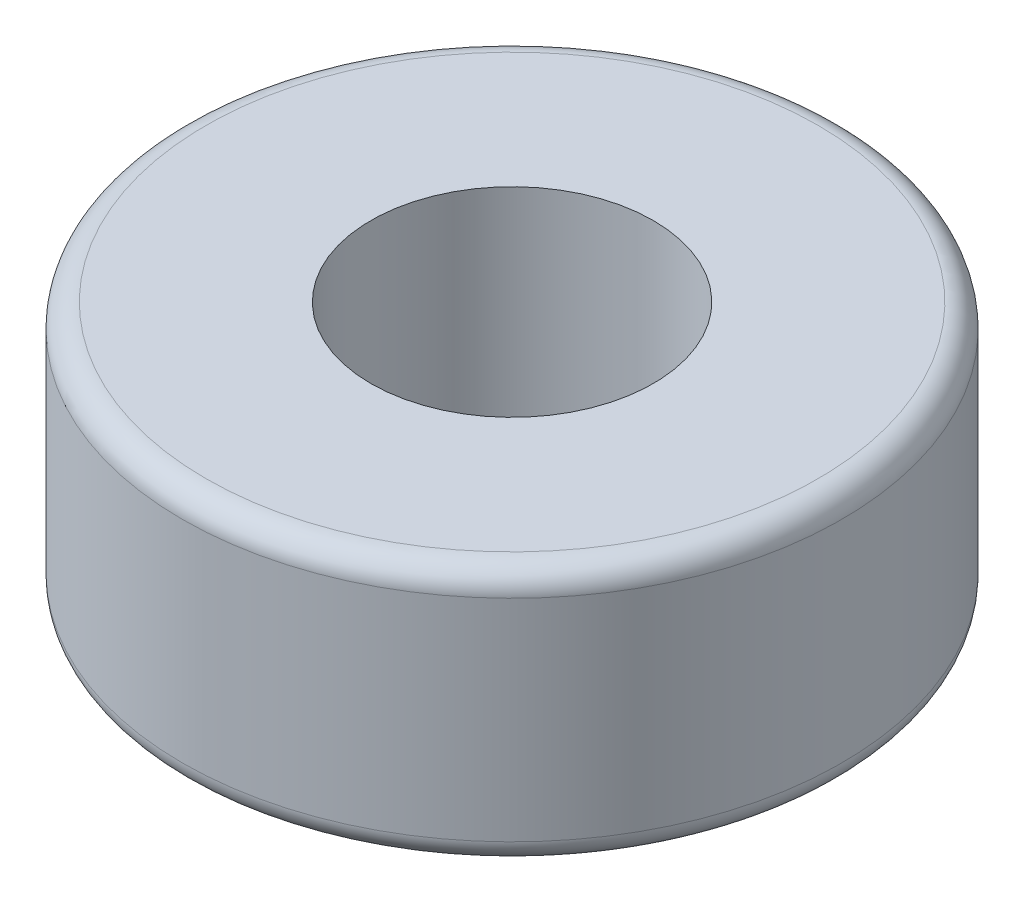
ISO-10303-21;
HEADER;
FILE_DESCRIPTION(('STEP AP214'),'2;1');
FILE_NAME('part.step','',(''),(''),'','','');
FILE_SCHEMA(('AUTOMOTIVE_DESIGN { 1 0 10303 214 1 1 1 1 }'));
ENDSEC;
DATA;
#1=APPLICATION_CONTEXT('core data for automotive mechanical design processes');
#2=APPLICATION_PROTOCOL_DEFINITION('international standard','automotive_design',2000,#1);
#3=PRODUCT_CONTEXT('',#1,'mechanical');
#4=PRODUCT('Part','Part','',(#3));
#5=PRODUCT_RELATED_PRODUCT_CATEGORY('part','',(#4));
#6=PRODUCT_DEFINITION_FORMATION('','',#4);
#7=PRODUCT_DEFINITION_CONTEXT('part definition',#1,'design');
#8=PRODUCT_DEFINITION('design','',#6,#7);
#9=PRODUCT_DEFINITION_SHAPE('','',#8);
#10=(LENGTH_UNIT() NAMED_UNIT(*) SI_UNIT(.MILLI.,.METRE.));
#11=(NAMED_UNIT(*) PLANE_ANGLE_UNIT() SI_UNIT($,.RADIAN.));
#12=(NAMED_UNIT(*) SI_UNIT($,.STERADIAN.) SOLID_ANGLE_UNIT());
#13=UNCERTAINTY_MEASURE_WITH_UNIT(LENGTH_MEASURE(1.E-05),#10,'distance_accuracy_value','');
#14=(GEOMETRIC_REPRESENTATION_CONTEXT(3) GLOBAL_UNCERTAINTY_ASSIGNED_CONTEXT((#13)) GLOBAL_UNIT_ASSIGNED_CONTEXT((#10,
#11,#12)) REPRESENTATION_CONTEXT('',''));
#15=CARTESIAN_POINT('',(0.,0.,0.));
#16=DIRECTION('',(0.,0.,1.));
#17=DIRECTION('',(1.,0.,0.));
#18=AXIS2_PLACEMENT_3D('',#15,#16,#17);
#19=CARTESIAN_POINT('',(0.,4.34975,0.));
#20=DIRECTION('',(0.,1.,0.));
#21=DIRECTION('',(0.,0.,1.));
#22=AXIS2_PLACEMENT_3D('',#19,#20,#21);
#23=PLANE('',#22);
#24=CARTESIAN_POINT('',(0.,4.34975,0.));
#25=DIRECTION('',(0.,1.,0.));
#26=DIRECTION('',(0.,0.,1.));
#27=AXIS2_PLACEMENT_3D('',#24,#25,#26);
#28=CIRCLE('',#27,10.31875);
#29=CARTESIAN_POINT('',(0.,4.34975,10.31875));
#30=VERTEX_POINT('',#29);
#31=EDGE_CURVE('E10',#30,#30,#28,.T.);
#32=ORIENTED_EDGE('',*,*,#31,.T.);
#33=EDGE_LOOP('',(#32));
#34=FACE_BOUND('',#33,.T.);
#35=CARTESIAN_POINT('',(0.,4.34975,0.));
#36=DIRECTION('',(0.,1.,0.));
#37=DIRECTION('',(0.,0.,1.));
#38=AXIS2_PLACEMENT_3D('',#35,#36,#37);
#39=CIRCLE('',#38,4.7625);
#40=CARTESIAN_POINT('',(0.,4.34975,4.7625));
#41=VERTEX_POINT('',#40);
#42=EDGE_CURVE('E52',#41,#41,#39,.T.);
#43=ORIENTED_EDGE('',*,*,#42,.F.);
#44=EDGE_LOOP('',(#43));
#45=FACE_BOUND('',#44,.T.);
#46=ADVANCED_FACE('F32',(#34,#45),#23,.T.);
#47=CARTESIAN_POINT('',(0.,-4.34975,0.));
#48=DIRECTION('',(0.,1.,0.));
#49=DIRECTION('',(0.,0.,1.));
#50=AXIS2_PLACEMENT_3D('',#47,#48,#49);
#51=PLANE('',#50);
#52=CARTESIAN_POINT('',(0.,-4.34975,0.));
#53=DIRECTION('',(0.,1.,0.));
#54=DIRECTION('',(0.,0.,1.));
#55=AXIS2_PLACEMENT_3D('',#52,#53,#54);
#56=CIRCLE('',#55,10.31875);
#57=CARTESIAN_POINT('',(0.,-4.34975,10.31875));
#58=VERTEX_POINT('',#57);
#59=EDGE_CURVE('E39',#58,#58,#56,.F.);
#60=ORIENTED_EDGE('',*,*,#59,.T.);
#61=EDGE_LOOP('',(#60));
#62=FACE_BOUND('',#61,.T.);
#63=CARTESIAN_POINT('',(0.,-4.34975,0.));
#64=DIRECTION('',(0.,1.,0.));
#65=DIRECTION('',(0.,0.,1.));
#66=AXIS2_PLACEMENT_3D('',#63,#64,#65);
#67=CIRCLE('',#66,4.7625);
#68=CARTESIAN_POINT('',(0.,-4.34975,4.7625));
#69=VERTEX_POINT('',#68);
#70=EDGE_CURVE('E53',#69,#69,#67,.T.);
#71=ORIENTED_EDGE('',*,*,#70,.T.);
#72=EDGE_LOOP('',(#71));
#73=FACE_BOUND('',#72,.T.);
#74=ADVANCED_FACE('F63',(#62,#73),#51,.F.);
#75=CARTESIAN_POINT('',(0.,4.34975,0.));
#76=DIRECTION('',(0.,-1.,0.));
#77=DIRECTION('',(0.,0.,-1.));
#78=AXIS2_PLACEMENT_3D('',#75,#76,#77);
#79=CYLINDRICAL_SURFACE('',#78,11.1125);
#80=CARTESIAN_POINT('',(0.,-3.556,0.));
#81=DIRECTION('',(0.,1.,0.));
#82=DIRECTION('',(0.,0.,1.));
#83=AXIS2_PLACEMENT_3D('',#80,#81,#82);
#84=CIRCLE('',#83,11.1125);
#85=CARTESIAN_POINT('',(0.,-3.556,11.1125));
#86=VERTEX_POINT('',#85);
#87=EDGE_CURVE('E43',#86,#86,#84,.T.);
#88=ORIENTED_EDGE('',*,*,#87,.T.);
#89=EDGE_LOOP('',(#88));
#90=FACE_BOUND('',#89,.T.);
#91=CARTESIAN_POINT('',(0.,3.556,0.));
#92=DIRECTION('',(0.,1.,0.));
#93=DIRECTION('',(0.,0.,1.));
#94=AXIS2_PLACEMENT_3D('',#91,#92,#93);
#95=CIRCLE('',#94,11.1125);
#96=CARTESIAN_POINT('',(0.,3.556,11.1125));
#97=VERTEX_POINT('',#96);
#98=EDGE_CURVE('E47',#97,#97,#95,.F.);
#99=ORIENTED_EDGE('',*,*,#98,.T.);
#100=EDGE_LOOP('',(#99));
#101=FACE_BOUND('',#100,.T.);
#102=ADVANCED_FACE('F68',(#90,#101),#79,.T.);
#103=CARTESIAN_POINT('',(0.,4.34975,0.));
#104=DIRECTION('',(0.,-1.,0.));
#105=DIRECTION('',(0.,0.,-1.));
#106=AXIS2_PLACEMENT_3D('',#103,#104,#105);
#107=CYLINDRICAL_SURFACE('',#106,4.7625);
#108=ORIENTED_EDGE('',*,*,#42,.T.);
#109=EDGE_LOOP('',(#108));
#110=FACE_BOUND('',#109,.T.);
#111=ORIENTED_EDGE('',*,*,#70,.F.);
#112=EDGE_LOOP('',(#111));
#113=FACE_BOUND('',#112,.T.);
#114=ADVANCED_FACE('F59',(#110,#113),#107,.F.);
#115=CARTESIAN_POINT('',(0.,-3.556,0.));
#116=DIRECTION('',(0.,1.,0.));
#117=DIRECTION('',(0.,0.,1.));
#118=AXIS2_PLACEMENT_3D('',#115,#116,#117);
#119=TOROIDAL_SURFACE('',#118,10.31875,0.79375);
#120=ORIENTED_EDGE('',*,*,#59,.F.);
#121=EDGE_LOOP('',(#120));
#122=FACE_BOUND('',#121,.T.);
#123=ORIENTED_EDGE('',*,*,#87,.F.);
#124=EDGE_LOOP('',(#123));
#125=FACE_BOUND('',#124,.T.);
#126=ADVANCED_FACE('F74',(#122,#125),#119,.T.);
#127=CARTESIAN_POINT('',(0.,3.556,0.));
#128=DIRECTION('',(0.,1.,0.));
#129=DIRECTION('',(0.,0.,1.));
#130=AXIS2_PLACEMENT_3D('',#127,#128,#129);
#131=TOROIDAL_SURFACE('',#130,10.31875,0.79375);
#132=ORIENTED_EDGE('',*,*,#98,.F.);
#133=EDGE_LOOP('',(#132));
#134=FACE_BOUND('',#133,.T.);
#135=ORIENTED_EDGE('',*,*,#31,.F.);
#136=EDGE_LOOP('',(#135));
#137=FACE_BOUND('',#136,.T.);
#138=ADVANCED_FACE('F34',(#134,#137),#131,.T.);
#139=CLOSED_SHELL('',(#46,#74,#102,#114,#126,#138));
#140=MANIFOLD_SOLID_BREP('B2',#139);
#141=ADVANCED_BREP_SHAPE_REPRESENTATION('',(#18,#140),#14);
#142=SHAPE_DEFINITION_REPRESENTATION(#9,#141);
ENDSEC;
END-ISO-10303-21;
